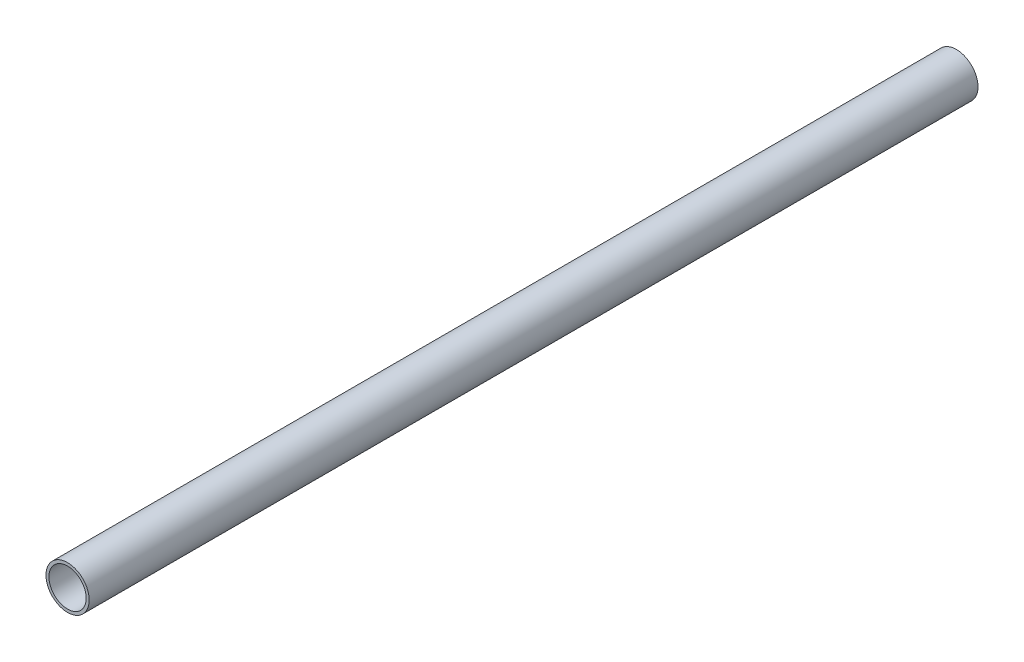
ISO-10303-21;
HEADER;
FILE_DESCRIPTION(('STEP AP214'),'2;1');
FILE_NAME('part.step','',(''),(''),'','','');
FILE_SCHEMA(('AUTOMOTIVE_DESIGN { 1 0 10303 214 1 1 1 1 }'));
ENDSEC;
DATA;
#1=APPLICATION_CONTEXT('core data for automotive mechanical design processes');
#2=APPLICATION_PROTOCOL_DEFINITION('international standard','automotive_design',2000,#1);
#3=PRODUCT_CONTEXT('',#1,'mechanical');
#4=PRODUCT('Part','Part','',(#3));
#5=PRODUCT_RELATED_PRODUCT_CATEGORY('part','',(#4));
#6=PRODUCT_DEFINITION_FORMATION('','',#4);
#7=PRODUCT_DEFINITION_CONTEXT('part definition',#1,'design');
#8=PRODUCT_DEFINITION('design','',#6,#7);
#9=PRODUCT_DEFINITION_SHAPE('','',#8);
#10=(LENGTH_UNIT() NAMED_UNIT(*) SI_UNIT(.MILLI.,.METRE.));
#11=(NAMED_UNIT(*) PLANE_ANGLE_UNIT() SI_UNIT($,.RADIAN.));
#12=(NAMED_UNIT(*) SI_UNIT($,.STERADIAN.) SOLID_ANGLE_UNIT());
#13=UNCERTAINTY_MEASURE_WITH_UNIT(LENGTH_MEASURE(1.E-05),#10,'distance_accuracy_value','');
#14=(GEOMETRIC_REPRESENTATION_CONTEXT(3) GLOBAL_UNCERTAINTY_ASSIGNED_CONTEXT((#13)) GLOBAL_UNIT_ASSIGNED_CONTEXT((#10,
#11,#12)) REPRESENTATION_CONTEXT('',''));
#15=CARTESIAN_POINT('',(0.,0.,0.));
#16=DIRECTION('',(0.,0.,1.));
#17=DIRECTION('',(1.,0.,0.));
#18=AXIS2_PLACEMENT_3D('',#15,#16,#17);
#19=CARTESIAN_POINT('',(0.,0.,457.2));
#20=DIRECTION('',(0.,0.,1.));
#21=DIRECTION('',(1.,0.,0.));
#22=AXIS2_PLACEMENT_3D('',#19,#20,#21);
#23=PLANE('',#22);
#24=CARTESIAN_POINT('',(0.,0.,457.2));
#25=DIRECTION('',(0.,0.,1.));
#26=DIRECTION('',(1.,0.,0.));
#27=AXIS2_PLACEMENT_3D('',#24,#25,#26);
#28=CIRCLE('',#27,22.225);
#29=CARTESIAN_POINT('',(22.225,0.,457.2));
#30=VERTEX_POINT('',#29);
#31=EDGE_CURVE('E10',#30,#30,#28,.T.);
#32=ORIENTED_EDGE('',*,*,#31,.T.);
#33=EDGE_LOOP('',(#32));
#34=FACE_BOUND('',#33,.T.);
#35=CARTESIAN_POINT('',(0.,0.,457.2));
#36=DIRECTION('',(0.,0.,1.));
#37=DIRECTION('',(1.,0.,0.));
#38=AXIS2_PLACEMENT_3D('',#35,#36,#37);
#39=CIRCLE('',#38,19.177);
#40=CARTESIAN_POINT('',(19.177,0.,457.2));
#41=VERTEX_POINT('',#40);
#42=EDGE_CURVE('E56',#41,#41,#39,.T.);
#43=ORIENTED_EDGE('',*,*,#42,.F.);
#44=EDGE_LOOP('',(#43));
#45=FACE_BOUND('',#44,.T.);
#46=ADVANCED_FACE('F43',(#34,#45),#23,.T.);
#47=CARTESIAN_POINT('',(0.,0.,-457.2));
#48=DIRECTION('',(0.,0.,1.));
#49=DIRECTION('',(1.,0.,0.));
#50=AXIS2_PLACEMENT_3D('',#47,#48,#49);
#51=PLANE('',#50);
#52=CARTESIAN_POINT('',(0.,0.,-457.2));
#53=DIRECTION('',(0.,0.,1.));
#54=DIRECTION('',(1.,0.,0.));
#55=AXIS2_PLACEMENT_3D('',#52,#53,#54);
#56=CIRCLE('',#55,22.225);
#57=CARTESIAN_POINT('',(22.225,0.,-457.2));
#58=VERTEX_POINT('',#57);
#59=EDGE_CURVE('E47',#58,#58,#56,.T.);
#60=ORIENTED_EDGE('',*,*,#59,.F.);
#61=EDGE_LOOP('',(#60));
#62=FACE_BOUND('',#61,.T.);
#63=CARTESIAN_POINT('',(0.,0.,-457.2));
#64=DIRECTION('',(0.,0.,1.));
#65=DIRECTION('',(1.,0.,0.));
#66=AXIS2_PLACEMENT_3D('',#63,#64,#65);
#67=CIRCLE('',#66,19.177);
#68=CARTESIAN_POINT('',(19.177,0.,-457.2));
#69=VERTEX_POINT('',#68);
#70=EDGE_CURVE('E58',#69,#69,#67,.T.);
#71=ORIENTED_EDGE('',*,*,#70,.T.);
#72=EDGE_LOOP('',(#71));
#73=FACE_BOUND('',#72,.T.);
#74=ADVANCED_FACE('F70',(#62,#73),#51,.F.);
#75=CARTESIAN_POINT('',(0.,0.,457.2));
#76=DIRECTION('',(0.,0.,-1.));
#77=DIRECTION('',(-1.,0.,0.));
#78=AXIS2_PLACEMENT_3D('',#75,#76,#77);
#79=CYLINDRICAL_SURFACE('',#78,22.225);
#80=ORIENTED_EDGE('',*,*,#31,.F.);
#81=EDGE_LOOP('',(#80));
#82=FACE_BOUND('',#81,.T.);
#83=ORIENTED_EDGE('',*,*,#59,.T.);
#84=EDGE_LOOP('',(#83));
#85=FACE_BOUND('',#84,.T.);
#86=ADVANCED_FACE('F45',(#82,#85),#79,.T.);
#87=CARTESIAN_POINT('',(0.,0.,457.2));
#88=DIRECTION('',(0.,0.,-1.));
#89=DIRECTION('',(-1.,0.,0.));
#90=AXIS2_PLACEMENT_3D('',#87,#88,#89);
#91=CYLINDRICAL_SURFACE('',#90,19.177);
#92=ORIENTED_EDGE('',*,*,#42,.T.);
#93=EDGE_LOOP('',(#92));
#94=FACE_BOUND('',#93,.T.);
#95=ORIENTED_EDGE('',*,*,#70,.F.);
#96=EDGE_LOOP('',(#95));
#97=FACE_BOUND('',#96,.T.);
#98=ADVANCED_FACE('F66',(#94,#97),#91,.F.);
#99=CLOSED_SHELL('',(#46,#74,#86,#98));
#100=MANIFOLD_SOLID_BREP('B2',#99);
#101=ADVANCED_BREP_SHAPE_REPRESENTATION('',(#18,#100),#14);
#102=SHAPE_DEFINITION_REPRESENTATION(#9,#101);
ENDSEC;
END-ISO-10303-21;
